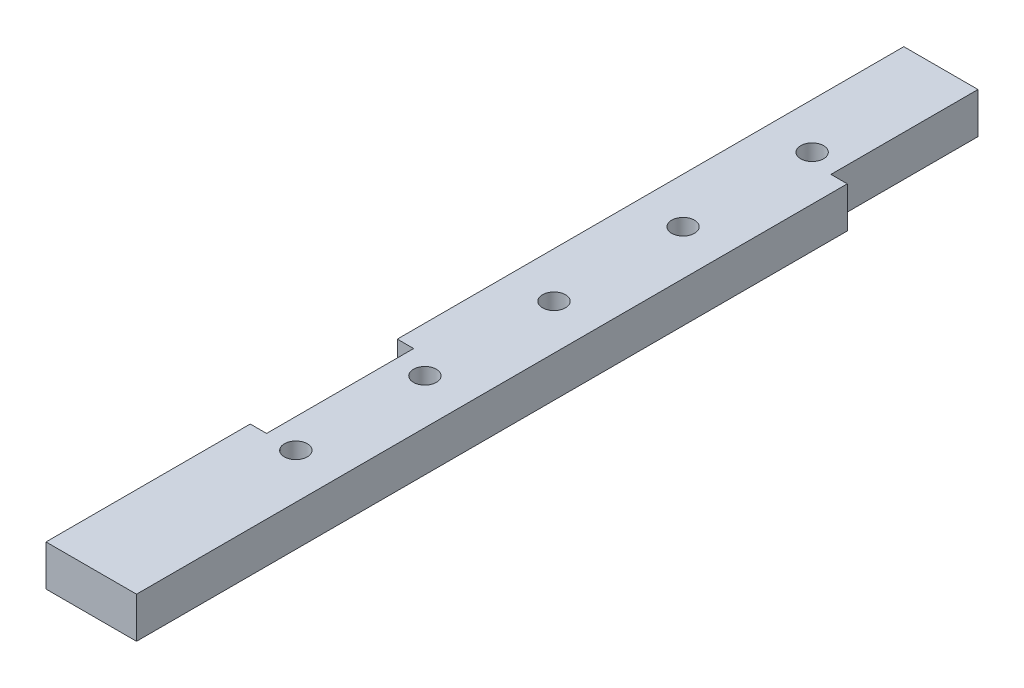
ISO-10303-21;
HEADER;
FILE_DESCRIPTION(('STEP AP214'),'2;1');
FILE_NAME('part.step','',(''),(''),'','','');
FILE_SCHEMA(('AUTOMOTIVE_DESIGN { 1 0 10303 214 1 1 1 1 }'));
ENDSEC;
DATA;
#1=APPLICATION_CONTEXT('core data for automotive mechanical design processes');
#2=APPLICATION_PROTOCOL_DEFINITION('international standard','automotive_design',2000,#1);
#3=PRODUCT_CONTEXT('',#1,'mechanical');
#4=PRODUCT('Part','Part','',(#3));
#5=PRODUCT_RELATED_PRODUCT_CATEGORY('part','',(#4));
#6=PRODUCT_DEFINITION_FORMATION('','',#4);
#7=PRODUCT_DEFINITION_CONTEXT('part definition',#1,'design');
#8=PRODUCT_DEFINITION('design','',#6,#7);
#9=PRODUCT_DEFINITION_SHAPE('','',#8);
#10=(LENGTH_UNIT() NAMED_UNIT(*) SI_UNIT(.MILLI.,.METRE.));
#11=(NAMED_UNIT(*) PLANE_ANGLE_UNIT() SI_UNIT($,.RADIAN.));
#12=(NAMED_UNIT(*) SI_UNIT($,.STERADIAN.) SOLID_ANGLE_UNIT());
#13=UNCERTAINTY_MEASURE_WITH_UNIT(LENGTH_MEASURE(1.E-05),#10,'distance_accuracy_value','');
#14=(GEOMETRIC_REPRESENTATION_CONTEXT(3) GLOBAL_UNCERTAINTY_ASSIGNED_CONTEXT((#13)) GLOBAL_UNIT_ASSIGNED_CONTEXT((#10,
#11,#12)) REPRESENTATION_CONTEXT('',''));
#15=CARTESIAN_POINT('',(0.,0.,0.));
#16=DIRECTION('',(0.,0.,1.));
#17=DIRECTION('',(1.,0.,0.));
#18=AXIS2_PLACEMENT_3D('',#15,#16,#17);
#19=CARTESIAN_POINT('',(5.08000000000003,42.164,0.));
#20=DIRECTION('',(1.,0.,0.));
#21=DIRECTION('',(0.,0.,-1.));
#22=AXIS2_PLACEMENT_3D('',#19,#20,#21);
#23=PLANE('',#22);
#24=DIRECTION('',(0.,0.,1.));
#25=VECTOR('',#24,1.);
#26=CARTESIAN_POINT('',(5.08000000000002,6.35,120.65));
#27=LINE('',#26,#25);
#28=CARTESIAN_POINT('',(5.08000000000003,6.35,88.9));
#29=VERTEX_POINT('',#28);
#30=CARTESIAN_POINT('',(5.08000000000002,6.35,120.65));
#31=VERTEX_POINT('',#30);
#32=EDGE_CURVE('E185',#29,#31,#27,.T.);
#33=ORIENTED_EDGE('',*,*,#32,.F.);
#34=DIRECTION('',(0.,-1.,0.));
#35=VECTOR('',#34,1.);
#36=CARTESIAN_POINT('',(5.08000000000003,29.350678250869,88.9));
#37=LINE('',#36,#35);
#38=CARTESIAN_POINT('',(5.08000000000003,0.,88.9));
#39=VERTEX_POINT('',#38);
#40=EDGE_CURVE('E166',#29,#39,#37,.T.);
#41=ORIENTED_EDGE('',*,*,#40,.T.);
#42=DIRECTION('',(0.,0.,1.));
#43=VECTOR('',#42,1.);
#44=CARTESIAN_POINT('',(5.08000000000003,0.,0.));
#45=LINE('',#44,#43);
#46=CARTESIAN_POINT('',(5.08000000000002,0.,120.65));
#47=VERTEX_POINT('',#46);
#48=EDGE_CURVE('E127',#39,#47,#45,.T.);
#49=ORIENTED_EDGE('',*,*,#48,.T.);
#50=DIRECTION('',(0.,-1.,0.));
#51=VECTOR('',#50,1.);
#52=CARTESIAN_POINT('',(5.08000000000002,42.164,120.65));
#53=LINE('',#52,#51);
#54=EDGE_CURVE('E126',#31,#47,#53,.T.);
#55=ORIENTED_EDGE('',*,*,#54,.F.);
#56=EDGE_LOOP('',(#33,#41,#49,#55));
#57=FACE_BOUND('',#56,.T.);
#58=ADVANCED_FACE('F37',(#57),#23,.F.);
#59=CARTESIAN_POINT('',(0.,0.,120.65));
#60=DIRECTION('',(0.,1.,0.));
#61=DIRECTION('',(0.,0.,1.));
#62=AXIS2_PLACEMENT_3D('',#59,#60,#61);
#63=PLANE('',#62);
#64=CARTESIAN_POINT('',(12.1666,0.,8.63599999999999));
#65=DIRECTION('',(0.,-1.,0.));
#66=DIRECTION('',(0.,0.,-1.));
#67=AXIS2_PLACEMENT_3D('',#64,#65,#66);
#68=CIRCLE('',#67,1.77799999999999);
#69=CARTESIAN_POINT('',(12.1666,0.,6.858));
#70=VERTEX_POINT('',#69);
#71=EDGE_CURVE('E293',#70,#70,#68,.T.);
#72=ORIENTED_EDGE('',*,*,#71,.F.);
#73=EDGE_LOOP('',(#72));
#74=FACE_BOUND('',#73,.T.);
#75=CARTESIAN_POINT('',(12.1666,0.,28.702));
#76=DIRECTION('',(0.,-1.,0.));
#77=DIRECTION('',(0.,0.,-1.));
#78=AXIS2_PLACEMENT_3D('',#75,#76,#77);
#79=CIRCLE('',#78,1.77799999999999);
#80=CARTESIAN_POINT('',(12.1666,0.,26.924));
#81=VERTEX_POINT('',#80);
#82=EDGE_CURVE('E289',#81,#81,#79,.T.);
#83=ORIENTED_EDGE('',*,*,#82,.F.);
#84=EDGE_LOOP('',(#83));
#85=FACE_BOUND('',#84,.T.);
#86=CARTESIAN_POINT('',(12.1666,0.,48.768));
#87=DIRECTION('',(0.,-1.,0.));
#88=DIRECTION('',(0.,0.,-1.));
#89=AXIS2_PLACEMENT_3D('',#86,#87,#88);
#90=CIRCLE('',#89,1.77799999999999);
#91=CARTESIAN_POINT('',(12.1666,0.,46.99));
#92=VERTEX_POINT('',#91);
#93=EDGE_CURVE('E285',#92,#92,#90,.T.);
#94=ORIENTED_EDGE('',*,*,#93,.F.);
#95=EDGE_LOOP('',(#94));
#96=FACE_BOUND('',#95,.T.);
#97=CARTESIAN_POINT('',(12.1666,0.,68.834));
#98=DIRECTION('',(0.,-1.,0.));
#99=DIRECTION('',(0.,0.,-1.));
#100=AXIS2_PLACEMENT_3D('',#97,#98,#99);
#101=CIRCLE('',#100,1.77799999999999);
#102=CARTESIAN_POINT('',(12.1666,0.,67.056));
#103=VERTEX_POINT('',#102);
#104=EDGE_CURVE('E279',#103,#103,#101,.T.);
#105=ORIENTED_EDGE('',*,*,#104,.F.);
#106=EDGE_LOOP('',(#105));
#107=FACE_BOUND('',#106,.T.);
#108=CARTESIAN_POINT('',(12.1666,0.,88.9));
#109=DIRECTION('',(0.,-1.,0.));
#110=DIRECTION('',(0.,0.,-1.));
#111=AXIS2_PLACEMENT_3D('',#108,#109,#110);
#112=CIRCLE('',#111,1.77799999999999);
#113=CARTESIAN_POINT('',(12.1666,0.,87.122));
#114=VERTEX_POINT('',#113);
#115=EDGE_CURVE('E145',#114,#114,#112,.T.);
#116=ORIENTED_EDGE('',*,*,#115,.F.);
#117=EDGE_LOOP('',(#116));
#118=FACE_BOUND('',#117,.T.);
#119=CARTESIAN_POINT('',(5.08000000000003,0.,-12.7));
#120=VERTEX_POINT('',#119);
#121=CARTESIAN_POINT('',(5.08000000000003,0.,66.04));
#122=VERTEX_POINT('',#121);
#123=EDGE_CURVE('E117',#120,#122,#45,.T.);
#124=ORIENTED_EDGE('',*,*,#123,.F.);
#125=DIRECTION('',(1.,0.,0.));
#126=VECTOR('',#125,1.);
#127=CARTESIAN_POINT('',(0.,0.,-12.7));
#128=LINE('',#127,#126);
#129=CARTESIAN_POINT('',(16.6116,0.,-12.7));
#130=VERTEX_POINT('',#129);
#131=EDGE_CURVE('E121',#120,#130,#128,.T.);
#132=ORIENTED_EDGE('',*,*,#131,.T.);
#133=DIRECTION('',(0.,0.,-1.));
#134=VECTOR('',#133,1.);
#135=CARTESIAN_POINT('',(16.6116,0.,-12.7));
#136=LINE('',#135,#134);
#137=CARTESIAN_POINT('',(16.6116,0.,10.16));
#138=VERTEX_POINT('',#137);
#139=EDGE_CURVE('E157',#138,#130,#136,.T.);
#140=ORIENTED_EDGE('',*,*,#139,.F.);
#141=DIRECTION('',(-1.,0.,0.));
#142=VECTOR('',#141,1.);
#143=CARTESIAN_POINT('',(19.1516,0.,10.16));
#144=LINE('',#143,#142);
#145=CARTESIAN_POINT('',(19.1516,0.,10.16));
#146=VERTEX_POINT('',#145);
#147=EDGE_CURVE('E154',#146,#138,#144,.T.);
#148=ORIENTED_EDGE('',*,*,#147,.F.);
#149=DIRECTION('',(0.,0.,1.));
#150=VECTOR('',#149,1.);
#151=CARTESIAN_POINT('',(19.1516,0.,0.));
#152=LINE('',#151,#150);
#153=CARTESIAN_POINT('',(19.1516,0.,120.65));
#154=VERTEX_POINT('',#153);
#155=EDGE_CURVE('E187',#146,#154,#152,.T.);
#156=ORIENTED_EDGE('',*,*,#155,.T.);
#157=DIRECTION('',(1.,0.,0.));
#158=VECTOR('',#157,1.);
#159=CARTESIAN_POINT('',(0.,0.,120.65));
#160=LINE('',#159,#158);
#161=EDGE_CURVE('E45',#47,#154,#160,.T.);
#162=ORIENTED_EDGE('',*,*,#161,.F.);
#163=ORIENTED_EDGE('',*,*,#48,.F.);
#164=DIRECTION('',(-1.,0.,0.));
#165=VECTOR('',#164,1.);
#166=CARTESIAN_POINT('',(5.08000000000003,0.,88.9));
#167=LINE('',#166,#165);
#168=CARTESIAN_POINT('',(7.62000000000003,0.,88.9));
#169=VERTEX_POINT('',#168);
#170=EDGE_CURVE('E172',#169,#39,#167,.T.);
#171=ORIENTED_EDGE('',*,*,#170,.F.);
#172=DIRECTION('',(0.,0.,1.));
#173=VECTOR('',#172,1.);
#174=CARTESIAN_POINT('',(7.62000000000003,0.,88.9));
#175=LINE('',#174,#173);
#176=CARTESIAN_POINT('',(7.62000000000003,0.,66.04));
#177=VERTEX_POINT('',#176);
#178=EDGE_CURVE('E169',#177,#169,#175,.T.);
#179=ORIENTED_EDGE('',*,*,#178,.F.);
#180=DIRECTION('',(1.,0.,0.));
#181=VECTOR('',#180,1.);
#182=CARTESIAN_POINT('',(5.08000000000003,0.,66.04));
#183=LINE('',#182,#181);
#184=EDGE_CURVE('E124',#122,#177,#183,.T.);
#185=ORIENTED_EDGE('',*,*,#184,.F.);
#186=EDGE_LOOP('',(#124,#132,#140,#148,#156,#162,#163,#171,#179,#185));
#187=FACE_BOUND('',#186,.T.);
#188=ADVANCED_FACE('F39',(#74,#85,#96,#107,#118,#187),#63,.F.);
#189=CARTESIAN_POINT('',(0.,6.35,120.65));
#190=DIRECTION('',(0.,-1.,0.));
#191=DIRECTION('',(0.,0.,-1.));
#192=AXIS2_PLACEMENT_3D('',#189,#190,#191);
#193=PLANE('',#192);
#194=CARTESIAN_POINT('',(12.1666,6.35,8.63599999999999));
#195=DIRECTION('',(0.,-1.,0.));
#196=DIRECTION('',(0.,0.,-1.));
#197=AXIS2_PLACEMENT_3D('',#194,#195,#196);
#198=CIRCLE('',#197,1.77799999999999);
#199=CARTESIAN_POINT('',(12.1666,6.35,6.858));
#200=VERTEX_POINT('',#199);
#201=EDGE_CURVE('E256',#200,#200,#198,.F.);
#202=ORIENTED_EDGE('',*,*,#201,.F.);
#203=EDGE_LOOP('',(#202));
#204=FACE_BOUND('',#203,.T.);
#205=CARTESIAN_POINT('',(12.1666,6.35,28.702));
#206=DIRECTION('',(0.,-1.,0.));
#207=DIRECTION('',(0.,0.,-1.));
#208=AXIS2_PLACEMENT_3D('',#205,#206,#207);
#209=CIRCLE('',#208,1.77799999999999);
#210=CARTESIAN_POINT('',(12.1666,6.35,26.924));
#211=VERTEX_POINT('',#210);
#212=EDGE_CURVE('E260',#211,#211,#209,.F.);
#213=ORIENTED_EDGE('',*,*,#212,.F.);
#214=EDGE_LOOP('',(#213));
#215=FACE_BOUND('',#214,.T.);
#216=CARTESIAN_POINT('',(12.1666,6.35,48.768));
#217=DIRECTION('',(0.,-1.,0.));
#218=DIRECTION('',(0.,0.,-1.));
#219=AXIS2_PLACEMENT_3D('',#216,#217,#218);
#220=CIRCLE('',#219,1.77799999999999);
#221=CARTESIAN_POINT('',(12.1666,6.35,46.99));
#222=VERTEX_POINT('',#221);
#223=EDGE_CURVE('E264',#222,#222,#220,.F.);
#224=ORIENTED_EDGE('',*,*,#223,.F.);
#225=EDGE_LOOP('',(#224));
#226=FACE_BOUND('',#225,.T.);
#227=CARTESIAN_POINT('',(12.1666,6.35,68.834));
#228=DIRECTION('',(0.,-1.,0.));
#229=DIRECTION('',(0.,0.,-1.));
#230=AXIS2_PLACEMENT_3D('',#227,#228,#229);
#231=CIRCLE('',#230,1.77799999999999);
#232=CARTESIAN_POINT('',(12.1666,6.35,67.056));
#233=VERTEX_POINT('',#232);
#234=EDGE_CURVE('E268',#233,#233,#231,.F.);
#235=ORIENTED_EDGE('',*,*,#234,.F.);
#236=EDGE_LOOP('',(#235));
#237=FACE_BOUND('',#236,.T.);
#238=CARTESIAN_POINT('',(12.1666,6.35,88.9));
#239=DIRECTION('',(0.,-1.,0.));
#240=DIRECTION('',(0.,0.,-1.));
#241=AXIS2_PLACEMENT_3D('',#238,#239,#240);
#242=CIRCLE('',#241,1.77799999999999);
#243=CARTESIAN_POINT('',(12.1666,6.35,87.122));
#244=VERTEX_POINT('',#243);
#245=EDGE_CURVE('E142',#244,#244,#242,.F.);
#246=ORIENTED_EDGE('',*,*,#245,.F.);
#247=EDGE_LOOP('',(#246));
#248=FACE_BOUND('',#247,.T.);
#249=DIRECTION('',(1.,0.,0.));
#250=VECTOR('',#249,1.);
#251=CARTESIAN_POINT('',(19.1516,6.35,10.16));
#252=LINE('',#251,#250);
#253=CARTESIAN_POINT('',(16.6116,6.35,10.16));
#254=VERTEX_POINT('',#253);
#255=CARTESIAN_POINT('',(19.1516,6.35,10.16));
#256=VERTEX_POINT('',#255);
#257=EDGE_CURVE('E52',#254,#256,#252,.T.);
#258=ORIENTED_EDGE('',*,*,#257,.F.);
#259=DIRECTION('',(0.,0.,1.));
#260=VECTOR('',#259,1.);
#261=CARTESIAN_POINT('',(16.6116,6.35,-12.7));
#262=LINE('',#261,#260);
#263=CARTESIAN_POINT('',(16.6116,6.35,-12.7));
#264=VERTEX_POINT('',#263);
#265=EDGE_CURVE('E151',#264,#254,#262,.T.);
#266=ORIENTED_EDGE('',*,*,#265,.F.);
#267=DIRECTION('',(-1.,0.,0.));
#268=VECTOR('',#267,1.);
#269=CARTESIAN_POINT('',(0.,6.35,-12.7));
#270=LINE('',#269,#268);
#271=CARTESIAN_POINT('',(5.08000000000003,6.35,-12.7));
#272=VERTEX_POINT('',#271);
#273=EDGE_CURVE('E149',#264,#272,#270,.T.);
#274=ORIENTED_EDGE('',*,*,#273,.T.);
#275=CARTESIAN_POINT('',(5.08000000000002,6.35,66.04));
#276=VERTEX_POINT('',#275);
#277=EDGE_CURVE('E133',#272,#276,#27,.T.);
#278=ORIENTED_EDGE('',*,*,#277,.T.);
#279=DIRECTION('',(-1.,0.,0.));
#280=VECTOR('',#279,1.);
#281=CARTESIAN_POINT('',(5.08000000000003,6.35,66.04));
#282=LINE('',#281,#280);
#283=CARTESIAN_POINT('',(7.62000000000003,6.35,66.04));
#284=VERTEX_POINT('',#283);
#285=EDGE_CURVE('E60',#284,#276,#282,.T.);
#286=ORIENTED_EDGE('',*,*,#285,.F.);
#287=DIRECTION('',(0.,0.,-1.));
#288=VECTOR('',#287,1.);
#289=CARTESIAN_POINT('',(7.62000000000003,6.35,88.9));
#290=LINE('',#289,#288);
#291=CARTESIAN_POINT('',(7.62000000000003,6.35,88.9));
#292=VERTEX_POINT('',#291);
#293=EDGE_CURVE('E163',#292,#284,#290,.T.);
#294=ORIENTED_EDGE('',*,*,#293,.F.);
#295=DIRECTION('',(1.,0.,0.));
#296=VECTOR('',#295,1.);
#297=CARTESIAN_POINT('',(5.08000000000003,6.35,88.9));
#298=LINE('',#297,#296);
#299=EDGE_CURVE('E165',#29,#292,#298,.T.);
#300=ORIENTED_EDGE('',*,*,#299,.F.);
#301=ORIENTED_EDGE('',*,*,#32,.T.);
#302=DIRECTION('',(-1.,0.,0.));
#303=VECTOR('',#302,1.);
#304=CARTESIAN_POINT('',(0.,6.35,120.65));
#305=LINE('',#304,#303);
#306=CARTESIAN_POINT('',(19.1516,6.35,120.65));
#307=VERTEX_POINT('',#306);
#308=EDGE_CURVE('E11',#307,#31,#305,.T.);
#309=ORIENTED_EDGE('',*,*,#308,.F.);
#310=DIRECTION('',(0.,0.,1.));
#311=VECTOR('',#310,1.);
#312=CARTESIAN_POINT('',(19.1516,6.35,120.65));
#313=LINE('',#312,#311);
#314=EDGE_CURVE('E192',#256,#307,#313,.T.);
#315=ORIENTED_EDGE('',*,*,#314,.F.);
#316=EDGE_LOOP('',(#258,#266,#274,#278,#286,#294,#300,#301,#309,#315));
#317=FACE_BOUND('',#316,.T.);
#318=ADVANCED_FACE('F206',(#204,#215,#226,#237,#248,#317),#193,.F.);
#319=CARTESIAN_POINT('',(0.,0.,120.65));
#320=DIRECTION('',(0.,0.,-1.));
#321=DIRECTION('',(-1.,0.,0.));
#322=AXIS2_PLACEMENT_3D('',#319,#320,#321);
#323=PLANE('',#322);
#324=ORIENTED_EDGE('',*,*,#308,.T.);
#325=ORIENTED_EDGE('',*,*,#54,.T.);
#326=ORIENTED_EDGE('',*,*,#161,.T.);
#327=DIRECTION('',(0.,-1.,0.));
#328=VECTOR('',#327,1.);
#329=CARTESIAN_POINT('',(19.1516,42.164,120.65));
#330=LINE('',#329,#328);
#331=EDGE_CURVE('E189',#307,#154,#330,.T.);
#332=ORIENTED_EDGE('',*,*,#331,.F.);
#333=EDGE_LOOP('',(#324,#325,#326,#332));
#334=FACE_BOUND('',#333,.T.);
#335=ADVANCED_FACE('F197',(#334),#323,.F.);
#336=CARTESIAN_POINT('',(19.1516,42.164,0.));
#337=DIRECTION('',(1.,0.,0.));
#338=DIRECTION('',(0.,0.,-1.));
#339=AXIS2_PLACEMENT_3D('',#336,#337,#338);
#340=PLANE('',#339);
#341=DIRECTION('',(0.,-1.,0.));
#342=VECTOR('',#341,1.);
#343=CARTESIAN_POINT('',(19.1516,29.350678250869,10.16));
#344=LINE('',#343,#342);
#345=EDGE_CURVE('E159',#256,#146,#344,.T.);
#346=ORIENTED_EDGE('',*,*,#345,.F.);
#347=ORIENTED_EDGE('',*,*,#314,.T.);
#348=ORIENTED_EDGE('',*,*,#331,.T.);
#349=ORIENTED_EDGE('',*,*,#155,.F.);
#350=EDGE_LOOP('',(#346,#347,#348,#349));
#351=FACE_BOUND('',#350,.T.);
#352=ADVANCED_FACE('F203',(#351),#340,.T.);
#353=ORIENTED_EDGE('',*,*,#123,.T.);
#354=DIRECTION('',(0.,-1.,0.));
#355=VECTOR('',#354,1.);
#356=CARTESIAN_POINT('',(5.08000000000003,29.350678250869,66.04));
#357=LINE('',#356,#355);
#358=EDGE_CURVE('E174',#276,#122,#357,.T.);
#359=ORIENTED_EDGE('',*,*,#358,.F.);
#360=ORIENTED_EDGE('',*,*,#277,.F.);
#361=DIRECTION('',(0.,-1.,0.));
#362=VECTOR('',#361,1.);
#363=CARTESIAN_POINT('',(5.08000000000003,23.5042355865833,-12.7));
#364=LINE('',#363,#362);
#365=EDGE_CURVE('E130',#272,#120,#364,.T.);
#366=ORIENTED_EDGE('',*,*,#365,.T.);
#367=EDGE_LOOP('',(#353,#359,#360,#366));
#368=FACE_BOUND('',#367,.T.);
#369=ADVANCED_FACE('F131',(#368),#23,.F.);
#370=CARTESIAN_POINT('',(5.08000000000003,29.350678250869,88.9));
#371=DIRECTION('',(0.,0.,1.));
#372=DIRECTION('',(1.,0.,0.));
#373=AXIS2_PLACEMENT_3D('',#370,#371,#372);
#374=PLANE('',#373);
#375=ORIENTED_EDGE('',*,*,#299,.T.);
#376=DIRECTION('',(0.,-1.,0.));
#377=VECTOR('',#376,1.);
#378=CARTESIAN_POINT('',(7.62000000000003,29.350678250869,88.9));
#379=LINE('',#378,#377);
#380=EDGE_CURVE('E177',#292,#169,#379,.T.);
#381=ORIENTED_EDGE('',*,*,#380,.T.);
#382=ORIENTED_EDGE('',*,*,#170,.T.);
#383=ORIENTED_EDGE('',*,*,#40,.F.);
#384=EDGE_LOOP('',(#375,#381,#382,#383));
#385=FACE_BOUND('',#384,.T.);
#386=ADVANCED_FACE('F213',(#385),#374,.F.);
#387=CARTESIAN_POINT('',(7.62000000000003,29.350678250869,88.9));
#388=DIRECTION('',(1.,0.,0.));
#389=DIRECTION('',(0.,0.,-1.));
#390=AXIS2_PLACEMENT_3D('',#387,#388,#389);
#391=PLANE('',#390);
#392=ORIENTED_EDGE('',*,*,#293,.T.);
#393=DIRECTION('',(0.,-1.,0.));
#394=VECTOR('',#393,1.);
#395=CARTESIAN_POINT('',(7.62000000000003,29.350678250869,66.04));
#396=LINE('',#395,#394);
#397=EDGE_CURVE('E179',#284,#177,#396,.T.);
#398=ORIENTED_EDGE('',*,*,#397,.T.);
#399=ORIENTED_EDGE('',*,*,#178,.T.);
#400=ORIENTED_EDGE('',*,*,#380,.F.);
#401=EDGE_LOOP('',(#392,#398,#399,#400));
#402=FACE_BOUND('',#401,.T.);
#403=ADVANCED_FACE('F216',(#402),#391,.F.);
#404=CARTESIAN_POINT('',(5.08000000000003,29.350678250869,66.04));
#405=DIRECTION('',(0.,0.,-1.));
#406=DIRECTION('',(-1.,0.,0.));
#407=AXIS2_PLACEMENT_3D('',#404,#405,#406);
#408=PLANE('',#407);
#409=ORIENTED_EDGE('',*,*,#285,.T.);
#410=ORIENTED_EDGE('',*,*,#358,.T.);
#411=ORIENTED_EDGE('',*,*,#184,.T.);
#412=ORIENTED_EDGE('',*,*,#397,.F.);
#413=EDGE_LOOP('',(#409,#410,#411,#412));
#414=FACE_BOUND('',#413,.T.);
#415=ADVANCED_FACE('F217',(#414),#408,.F.);
#416=CARTESIAN_POINT('',(16.6116,29.350678250869,-12.7));
#417=DIRECTION('',(-1.,0.,0.));
#418=DIRECTION('',(0.,0.,1.));
#419=AXIS2_PLACEMENT_3D('',#416,#417,#418);
#420=PLANE('',#419);
#421=ORIENTED_EDGE('',*,*,#139,.T.);
#422=DIRECTION('',(0.,-1.,0.));
#423=VECTOR('',#422,1.);
#424=CARTESIAN_POINT('',(16.6116,23.5042355865833,-12.7));
#425=LINE('',#424,#423);
#426=EDGE_CURVE('E137',#264,#130,#425,.T.);
#427=ORIENTED_EDGE('',*,*,#426,.F.);
#428=ORIENTED_EDGE('',*,*,#265,.T.);
#429=DIRECTION('',(0.,-1.,0.));
#430=VECTOR('',#429,1.);
#431=CARTESIAN_POINT('',(16.6116,29.350678250869,10.16));
#432=LINE('',#431,#430);
#433=EDGE_CURVE('E153',#254,#138,#432,.T.);
#434=ORIENTED_EDGE('',*,*,#433,.T.);
#435=EDGE_LOOP('',(#421,#427,#428,#434));
#436=FACE_BOUND('',#435,.T.);
#437=ADVANCED_FACE('F219',(#436),#420,.F.);
#438=CARTESIAN_POINT('',(19.1516,29.350678250869,10.16));
#439=DIRECTION('',(0.,0.,1.));
#440=DIRECTION('',(1.,0.,0.));
#441=AXIS2_PLACEMENT_3D('',#438,#439,#440);
#442=PLANE('',#441);
#443=ORIENTED_EDGE('',*,*,#257,.T.);
#444=ORIENTED_EDGE('',*,*,#345,.T.);
#445=ORIENTED_EDGE('',*,*,#147,.T.);
#446=ORIENTED_EDGE('',*,*,#433,.F.);
#447=EDGE_LOOP('',(#443,#444,#445,#446));
#448=FACE_BOUND('',#447,.T.);
#449=ADVANCED_FACE('F221',(#448),#442,.F.);
#450=CARTESIAN_POINT('',(0.,23.5042355865833,-12.7));
#451=DIRECTION('',(0.,0.,-1.));
#452=DIRECTION('',(-1.,0.,0.));
#453=AXIS2_PLACEMENT_3D('',#450,#451,#452);
#454=PLANE('',#453);
#455=ORIENTED_EDGE('',*,*,#273,.F.);
#456=ORIENTED_EDGE('',*,*,#426,.T.);
#457=ORIENTED_EDGE('',*,*,#131,.F.);
#458=ORIENTED_EDGE('',*,*,#365,.F.);
#459=EDGE_LOOP('',(#455,#456,#457,#458));
#460=FACE_BOUND('',#459,.T.);
#461=ADVANCED_FACE('F140',(#460),#454,.T.);
#462=CARTESIAN_POINT('',(12.1666,11.3789434277987,88.9));
#463=DIRECTION('',(0.,-1.,0.));
#464=DIRECTION('',(0.,0.,-1.));
#465=AXIS2_PLACEMENT_3D('',#462,#463,#464);
#466=CYLINDRICAL_SURFACE('',#465,1.77799999999999);
#467=CARTESIAN_POINT('',(12.1666,6.35,87.122));
#468=CARTESIAN_POINT('',(12.1666,6.28385416666667,87.122));
#469=CARTESIAN_POINT('',(12.1666,6.21770833333333,87.122));
#470=CARTESIAN_POINT('',(12.1666,6.08541666666667,87.122));
#471=CARTESIAN_POINT('',(12.1666,6.01927083333333,87.122));
#472=CARTESIAN_POINT('',(12.1666,5.88697916666667,87.122));
#473=CARTESIAN_POINT('',(12.1666,5.82083333333333,87.122));
#474=CARTESIAN_POINT('',(12.1666,5.68854166666667,87.122));
#475=CARTESIAN_POINT('',(12.1666,5.62239583333333,87.122));
#476=CARTESIAN_POINT('',(12.1666,5.49010416666667,87.122));
#477=CARTESIAN_POINT('',(12.1666,5.42395833333333,87.122));
#478=CARTESIAN_POINT('',(12.1666,5.29166666666667,87.122));
#479=CARTESIAN_POINT('',(12.1666,5.22552083333333,87.122));
#480=CARTESIAN_POINT('',(12.1666,5.09322916666667,87.122));
#481=CARTESIAN_POINT('',(12.1666,5.02708333333333,87.122));
#482=CARTESIAN_POINT('',(12.1666,4.89479166666667,87.122));
#483=CARTESIAN_POINT('',(12.1666,4.82864583333333,87.122));
#484=CARTESIAN_POINT('',(12.1666,4.69635416666667,87.122));
#485=CARTESIAN_POINT('',(12.1666,4.63020833333333,87.122));
#486=CARTESIAN_POINT('',(12.1666,4.49791666666667,87.122));
#487=CARTESIAN_POINT('',(12.1666,4.43177083333333,87.122));
#488=CARTESIAN_POINT('',(12.1666,4.29947916666667,87.122));
#489=CARTESIAN_POINT('',(12.1666,4.23333333333333,87.122));
#490=CARTESIAN_POINT('',(12.1666,4.10104166666667,87.122));
#491=CARTESIAN_POINT('',(12.1666,4.03489583333333,87.122));
#492=CARTESIAN_POINT('',(12.1666,3.90260416666667,87.122));
#493=CARTESIAN_POINT('',(12.1666,3.83645833333333,87.122));
#494=CARTESIAN_POINT('',(12.1666,3.70416666666667,87.122));
#495=CARTESIAN_POINT('',(12.1666,3.63802083333333,87.122));
#496=CARTESIAN_POINT('',(12.1666,3.50572916666667,87.122));
#497=CARTESIAN_POINT('',(12.1666,3.43958333333333,87.122));
#498=CARTESIAN_POINT('',(12.1666,3.30729166666667,87.122));
#499=CARTESIAN_POINT('',(12.1666,3.24114583333334,87.122));
#500=CARTESIAN_POINT('',(12.1666,3.10885416666667,87.122));
#501=CARTESIAN_POINT('',(12.1666,3.04270833333334,87.122));
#502=CARTESIAN_POINT('',(12.1666,2.91041666666667,87.122));
#503=CARTESIAN_POINT('',(12.1666,2.84427083333333,87.122));
#504=CARTESIAN_POINT('',(12.1666,2.71197916666667,87.122));
#505=CARTESIAN_POINT('',(12.1666,2.64583333333334,87.122));
#506=CARTESIAN_POINT('',(12.1666,2.51354166666667,87.122));
#507=CARTESIAN_POINT('',(12.1666,2.44739583333333,87.122));
#508=CARTESIAN_POINT('',(12.1666,2.31510416666667,87.122));
#509=CARTESIAN_POINT('',(12.1666,2.24895833333333,87.122));
#510=CARTESIAN_POINT('',(12.1666,2.11666666666667,87.122));
#511=CARTESIAN_POINT('',(12.1666,2.05052083333333,87.122));
#512=CARTESIAN_POINT('',(12.1666,1.91822916666667,87.122));
#513=CARTESIAN_POINT('',(12.1666,1.85208333333334,87.122));
#514=CARTESIAN_POINT('',(12.1666,1.71979166666667,87.122));
#515=CARTESIAN_POINT('',(12.1666,1.65364583333334,87.122));
#516=CARTESIAN_POINT('',(12.1666,1.52135416666667,87.122));
#517=CARTESIAN_POINT('',(12.1666,1.45520833333333,87.122));
#518=CARTESIAN_POINT('',(12.1666,1.32291666666667,87.122));
#519=CARTESIAN_POINT('',(12.1666,1.25677083333334,87.122));
#520=CARTESIAN_POINT('',(12.1666,1.12447916666667,87.122));
#521=CARTESIAN_POINT('',(12.1666,1.05833333333334,87.122));
#522=CARTESIAN_POINT('',(12.1666,0.926041666666668,87.122));
#523=CARTESIAN_POINT('',(12.1666,0.859895833333335,87.122));
#524=CARTESIAN_POINT('',(12.1666,0.727604166666668,87.122));
#525=CARTESIAN_POINT('',(12.1666,0.661458333333335,87.122));
#526=CARTESIAN_POINT('',(12.1666,0.529166666666668,87.122));
#527=CARTESIAN_POINT('',(12.1666,0.463020833333335,87.122));
#528=CARTESIAN_POINT('',(12.1666,0.330729166666668,87.122));
#529=CARTESIAN_POINT('',(12.1666,0.264583333333334,87.122));
#530=CARTESIAN_POINT('',(12.1666,0.132291666666668,87.122));
#531=CARTESIAN_POINT('',(12.1666,0.0661458333333348,87.122));
#532=CARTESIAN_POINT('',(12.1666,0.,87.122));
#533=B_SPLINE_CURVE_WITH_KNOTS('',3,(#467,#468,#469,#470,#471,#472,#473,#474,#475,#476,#477,
#478,#479,#480,#481,#482,#483,#484,#485,#486,#487,#488,#489,#490,#491,#492,#493,#494,#495,#496,
#497,#498,#499,#500,#501,#502,#503,#504,#505,#506,#507,#508,#509,#510,#511,#512,#513,#514,#515,
#516,#517,#518,#519,#520,#521,#522,#523,#524,#525,#526,#527,#528,#529,#530,#531,#532),
.UNSPECIFIED.,.F.,.F.,(4,2,2,2,2,2,2,2,2,2,2,2,2,2,2,2,2,2,2,2,2,2,2,2,2,2,2,2,2,2,2,2,4),(0.,
0.1984375,0.396875,0.5953125,0.79375,0.9921875,1.190625,1.3890625,1.5875,1.7859375,1.984375,
2.1828125,2.38125,2.5796875,2.778125,2.9765625,3.175,3.3734375,3.571875,3.7703125,3.96875,
4.1671875,4.365625,4.5640625,4.7625,4.9609375,5.159375,5.3578125,5.55625,5.7546875,5.953125,
6.1515625,6.35),.UNSPECIFIED.);
#534=EDGE_CURVE('BSEAM228',#244,#114,#533,.T.);
#535=ORIENTED_EDGE('',*,*,#245,.T.);
#536=ORIENTED_EDGE('',*,*,#115,.T.);
#537=ORIENTED_EDGE('',*,*,#534,.T.);
#538=ORIENTED_EDGE('',*,*,#534,.F.);
#539=EDGE_LOOP('',(#535,#537,#536,#538));
#540=FACE_BOUND('',#539,.T.);
#541=ADVANCED_FACE('F228',(#540),#466,.F.);
#542=CARTESIAN_POINT('',(12.1666,11.3789434277987,68.834));
#543=DIRECTION('',(0.,-1.,0.));
#544=DIRECTION('',(0.,0.,-1.));
#545=AXIS2_PLACEMENT_3D('',#542,#543,#544);
#546=CYLINDRICAL_SURFACE('',#545,1.77799999999999);
#547=CARTESIAN_POINT('',(12.1666,6.35,67.056));
#548=CARTESIAN_POINT('',(12.1666,6.28385416666667,67.056));
#549=CARTESIAN_POINT('',(12.1666,6.21770833333333,67.056));
#550=CARTESIAN_POINT('',(12.1666,6.08541666666667,67.056));
#551=CARTESIAN_POINT('',(12.1666,6.01927083333333,67.056));
#552=CARTESIAN_POINT('',(12.1666,5.88697916666667,67.056));
#553=CARTESIAN_POINT('',(12.1666,5.82083333333333,67.056));
#554=CARTESIAN_POINT('',(12.1666,5.68854166666667,67.056));
#555=CARTESIAN_POINT('',(12.1666,5.62239583333333,67.056));
#556=CARTESIAN_POINT('',(12.1666,5.49010416666667,67.056));
#557=CARTESIAN_POINT('',(12.1666,5.42395833333333,67.056));
#558=CARTESIAN_POINT('',(12.1666,5.29166666666667,67.056));
#559=CARTESIAN_POINT('',(12.1666,5.22552083333333,67.056));
#560=CARTESIAN_POINT('',(12.1666,5.09322916666667,67.056));
#561=CARTESIAN_POINT('',(12.1666,5.02708333333333,67.056));
#562=CARTESIAN_POINT('',(12.1666,4.89479166666667,67.056));
#563=CARTESIAN_POINT('',(12.1666,4.82864583333333,67.056));
#564=CARTESIAN_POINT('',(12.1666,4.69635416666667,67.056));
#565=CARTESIAN_POINT('',(12.1666,4.63020833333333,67.056));
#566=CARTESIAN_POINT('',(12.1666,4.49791666666667,67.056));
#567=CARTESIAN_POINT('',(12.1666,4.43177083333333,67.056));
#568=CARTESIAN_POINT('',(12.1666,4.29947916666667,67.056));
#569=CARTESIAN_POINT('',(12.1666,4.23333333333333,67.056));
#570=CARTESIAN_POINT('',(12.1666,4.10104166666667,67.056));
#571=CARTESIAN_POINT('',(12.1666,4.03489583333333,67.056));
#572=CARTESIAN_POINT('',(12.1666,3.90260416666667,67.056));
#573=CARTESIAN_POINT('',(12.1666,3.83645833333333,67.056));
#574=CARTESIAN_POINT('',(12.1666,3.70416666666667,67.056));
#575=CARTESIAN_POINT('',(12.1666,3.63802083333333,67.056));
#576=CARTESIAN_POINT('',(12.1666,3.50572916666667,67.056));
#577=CARTESIAN_POINT('',(12.1666,3.43958333333333,67.056));
#578=CARTESIAN_POINT('',(12.1666,3.30729166666667,67.056));
#579=CARTESIAN_POINT('',(12.1666,3.24114583333334,67.056));
#580=CARTESIAN_POINT('',(12.1666,3.10885416666667,67.056));
#581=CARTESIAN_POINT('',(12.1666,3.04270833333334,67.056));
#582=CARTESIAN_POINT('',(12.1666,2.91041666666667,67.056));
#583=CARTESIAN_POINT('',(12.1666,2.84427083333333,67.056));
#584=CARTESIAN_POINT('',(12.1666,2.71197916666667,67.056));
#585=CARTESIAN_POINT('',(12.1666,2.64583333333334,67.056));
#586=CARTESIAN_POINT('',(12.1666,2.51354166666667,67.056));
#587=CARTESIAN_POINT('',(12.1666,2.44739583333333,67.056));
#588=CARTESIAN_POINT('',(12.1666,2.31510416666667,67.056));
#589=CARTESIAN_POINT('',(12.1666,2.24895833333333,67.056));
#590=CARTESIAN_POINT('',(12.1666,2.11666666666667,67.056));
#591=CARTESIAN_POINT('',(12.1666,2.05052083333333,67.056));
#592=CARTESIAN_POINT('',(12.1666,1.91822916666667,67.056));
#593=CARTESIAN_POINT('',(12.1666,1.85208333333334,67.056));
#594=CARTESIAN_POINT('',(12.1666,1.71979166666667,67.056));
#595=CARTESIAN_POINT('',(12.1666,1.65364583333334,67.056));
#596=CARTESIAN_POINT('',(12.1666,1.52135416666667,67.056));
#597=CARTESIAN_POINT('',(12.1666,1.45520833333333,67.056));
#598=CARTESIAN_POINT('',(12.1666,1.32291666666667,67.056));
#599=CARTESIAN_POINT('',(12.1666,1.25677083333334,67.056));
#600=CARTESIAN_POINT('',(12.1666,1.12447916666667,67.056));
#601=CARTESIAN_POINT('',(12.1666,1.05833333333334,67.056));
#602=CARTESIAN_POINT('',(12.1666,0.926041666666668,67.056));
#603=CARTESIAN_POINT('',(12.1666,0.859895833333335,67.056));
#604=CARTESIAN_POINT('',(12.1666,0.727604166666668,67.056));
#605=CARTESIAN_POINT('',(12.1666,0.661458333333335,67.056));
#606=CARTESIAN_POINT('',(12.1666,0.529166666666668,67.056));
#607=CARTESIAN_POINT('',(12.1666,0.463020833333335,67.056));
#608=CARTESIAN_POINT('',(12.1666,0.330729166666668,67.056));
#609=CARTESIAN_POINT('',(12.1666,0.264583333333334,67.056));
#610=CARTESIAN_POINT('',(12.1666,0.132291666666668,67.056));
#611=CARTESIAN_POINT('',(12.1666,0.0661458333333348,67.056));
#612=CARTESIAN_POINT('',(12.1666,0.,67.056));
#613=B_SPLINE_CURVE_WITH_KNOTS('',3,(#547,#548,#549,#550,#551,#552,#553,#554,#555,#556,#557,
#558,#559,#560,#561,#562,#563,#564,#565,#566,#567,#568,#569,#570,#571,#572,#573,#574,#575,#576,
#577,#578,#579,#580,#581,#582,#583,#584,#585,#586,#587,#588,#589,#590,#591,#592,#593,#594,#595,
#596,#597,#598,#599,#600,#601,#602,#603,#604,#605,#606,#607,#608,#609,#610,#611,#612),
.UNSPECIFIED.,.F.,.F.,(4,2,2,2,2,2,2,2,2,2,2,2,2,2,2,2,2,2,2,2,2,2,2,2,2,2,2,2,2,2,2,2,4),(0.,
0.1984375,0.396875,0.5953125,0.79375,0.9921875,1.190625,1.3890625,1.5875,1.7859375,1.984375,
2.1828125,2.38125,2.5796875,2.778125,2.9765625,3.175,3.3734375,3.571875,3.7703125,3.96875,
4.1671875,4.365625,4.5640625,4.7625,4.9609375,5.159375,5.3578125,5.55625,5.7546875,5.953125,
6.1515625,6.35),.UNSPECIFIED.);
#614=EDGE_CURVE('BSEAM273',#233,#103,#613,.T.);
#615=ORIENTED_EDGE('',*,*,#234,.T.);
#616=ORIENTED_EDGE('',*,*,#104,.T.);
#617=ORIENTED_EDGE('',*,*,#614,.T.);
#618=ORIENTED_EDGE('',*,*,#614,.F.);
#619=EDGE_LOOP('',(#615,#617,#616,#618));
#620=FACE_BOUND('',#619,.T.);
#621=ADVANCED_FACE('F273',(#620),#546,.F.);
#622=CARTESIAN_POINT('',(12.1666,11.3789434277987,48.768));
#623=DIRECTION('',(0.,-1.,0.));
#624=DIRECTION('',(0.,0.,-1.));
#625=AXIS2_PLACEMENT_3D('',#622,#623,#624);
#626=CYLINDRICAL_SURFACE('',#625,1.77799999999999);
#627=CARTESIAN_POINT('',(12.1666,6.35,46.99));
#628=CARTESIAN_POINT('',(12.1666,6.28385416666667,46.99));
#629=CARTESIAN_POINT('',(12.1666,6.21770833333333,46.99));
#630=CARTESIAN_POINT('',(12.1666,6.08541666666667,46.99));
#631=CARTESIAN_POINT('',(12.1666,6.01927083333333,46.99));
#632=CARTESIAN_POINT('',(12.1666,5.88697916666667,46.99));
#633=CARTESIAN_POINT('',(12.1666,5.82083333333333,46.99));
#634=CARTESIAN_POINT('',(12.1666,5.68854166666667,46.99));
#635=CARTESIAN_POINT('',(12.1666,5.62239583333333,46.99));
#636=CARTESIAN_POINT('',(12.1666,5.49010416666667,46.99));
#637=CARTESIAN_POINT('',(12.1666,5.42395833333333,46.99));
#638=CARTESIAN_POINT('',(12.1666,5.29166666666667,46.99));
#639=CARTESIAN_POINT('',(12.1666,5.22552083333333,46.99));
#640=CARTESIAN_POINT('',(12.1666,5.09322916666667,46.99));
#641=CARTESIAN_POINT('',(12.1666,5.02708333333333,46.99));
#642=CARTESIAN_POINT('',(12.1666,4.89479166666667,46.99));
#643=CARTESIAN_POINT('',(12.1666,4.82864583333333,46.99));
#644=CARTESIAN_POINT('',(12.1666,4.69635416666667,46.99));
#645=CARTESIAN_POINT('',(12.1666,4.63020833333333,46.99));
#646=CARTESIAN_POINT('',(12.1666,4.49791666666667,46.99));
#647=CARTESIAN_POINT('',(12.1666,4.43177083333333,46.99));
#648=CARTESIAN_POINT('',(12.1666,4.29947916666667,46.99));
#649=CARTESIAN_POINT('',(12.1666,4.23333333333333,46.99));
#650=CARTESIAN_POINT('',(12.1666,4.10104166666667,46.99));
#651=CARTESIAN_POINT('',(12.1666,4.03489583333333,46.99));
#652=CARTESIAN_POINT('',(12.1666,3.90260416666667,46.99));
#653=CARTESIAN_POINT('',(12.1666,3.83645833333333,46.99));
#654=CARTESIAN_POINT('',(12.1666,3.70416666666667,46.99));
#655=CARTESIAN_POINT('',(12.1666,3.63802083333333,46.99));
#656=CARTESIAN_POINT('',(12.1666,3.50572916666667,46.99));
#657=CARTESIAN_POINT('',(12.1666,3.43958333333333,46.99));
#658=CARTESIAN_POINT('',(12.1666,3.30729166666667,46.99));
#659=CARTESIAN_POINT('',(12.1666,3.24114583333334,46.99));
#660=CARTESIAN_POINT('',(12.1666,3.10885416666667,46.99));
#661=CARTESIAN_POINT('',(12.1666,3.04270833333334,46.99));
#662=CARTESIAN_POINT('',(12.1666,2.91041666666667,46.99));
#663=CARTESIAN_POINT('',(12.1666,2.84427083333333,46.99));
#664=CARTESIAN_POINT('',(12.1666,2.71197916666667,46.99));
#665=CARTESIAN_POINT('',(12.1666,2.64583333333334,46.99));
#666=CARTESIAN_POINT('',(12.1666,2.51354166666667,46.99));
#667=CARTESIAN_POINT('',(12.1666,2.44739583333333,46.99));
#668=CARTESIAN_POINT('',(12.1666,2.31510416666667,46.99));
#669=CARTESIAN_POINT('',(12.1666,2.24895833333333,46.99));
#670=CARTESIAN_POINT('',(12.1666,2.11666666666667,46.99));
#671=CARTESIAN_POINT('',(12.1666,2.05052083333333,46.99));
#672=CARTESIAN_POINT('',(12.1666,1.91822916666667,46.99));
#673=CARTESIAN_POINT('',(12.1666,1.85208333333334,46.99));
#674=CARTESIAN_POINT('',(12.1666,1.71979166666667,46.99));
#675=CARTESIAN_POINT('',(12.1666,1.65364583333334,46.99));
#676=CARTESIAN_POINT('',(12.1666,1.52135416666667,46.99));
#677=CARTESIAN_POINT('',(12.1666,1.45520833333333,46.99));
#678=CARTESIAN_POINT('',(12.1666,1.32291666666667,46.99));
#679=CARTESIAN_POINT('',(12.1666,1.25677083333334,46.99));
#680=CARTESIAN_POINT('',(12.1666,1.12447916666667,46.99));
#681=CARTESIAN_POINT('',(12.1666,1.05833333333334,46.99));
#682=CARTESIAN_POINT('',(12.1666,0.926041666666668,46.99));
#683=CARTESIAN_POINT('',(12.1666,0.859895833333335,46.99));
#684=CARTESIAN_POINT('',(12.1666,0.727604166666668,46.99));
#685=CARTESIAN_POINT('',(12.1666,0.661458333333335,46.99));
#686=CARTESIAN_POINT('',(12.1666,0.529166666666668,46.99));
#687=CARTESIAN_POINT('',(12.1666,0.463020833333335,46.99));
#688=CARTESIAN_POINT('',(12.1666,0.330729166666668,46.99));
#689=CARTESIAN_POINT('',(12.1666,0.264583333333334,46.99));
#690=CARTESIAN_POINT('',(12.1666,0.132291666666668,46.99));
#691=CARTESIAN_POINT('',(12.1666,0.0661458333333348,46.99));
#692=CARTESIAN_POINT('',(12.1666,0.,46.99));
#693=B_SPLINE_CURVE_WITH_KNOTS('',3,(#627,#628,#629,#630,#631,#632,#633,#634,#635,#636,#637,
#638,#639,#640,#641,#642,#643,#644,#645,#646,#647,#648,#649,#650,#651,#652,#653,#654,#655,#656,
#657,#658,#659,#660,#661,#662,#663,#664,#665,#666,#667,#668,#669,#670,#671,#672,#673,#674,#675,
#676,#677,#678,#679,#680,#681,#682,#683,#684,#685,#686,#687,#688,#689,#690,#691,#692),
.UNSPECIFIED.,.F.,.F.,(4,2,2,2,2,2,2,2,2,2,2,2,2,2,2,2,2,2,2,2,2,2,2,2,2,2,2,2,2,2,2,2,4),(0.,
0.1984375,0.396875,0.5953125,0.79375,0.9921875,1.190625,1.3890625,1.5875,1.7859375,1.984375,
2.1828125,2.38125,2.5796875,2.778125,2.9765625,3.175,3.3734375,3.571875,3.7703125,3.96875,
4.1671875,4.365625,4.5640625,4.7625,4.9609375,5.159375,5.3578125,5.55625,5.7546875,5.953125,
6.1515625,6.35),.UNSPECIFIED.);
#694=EDGE_CURVE('BSEAM306',#222,#92,#693,.T.);
#695=ORIENTED_EDGE('',*,*,#223,.T.);
#696=ORIENTED_EDGE('',*,*,#93,.T.);
#697=ORIENTED_EDGE('',*,*,#694,.T.);
#698=ORIENTED_EDGE('',*,*,#694,.F.);
#699=EDGE_LOOP('',(#695,#697,#696,#698));
#700=FACE_BOUND('',#699,.T.);
#701=ADVANCED_FACE('F306',(#700),#626,.F.);
#702=CARTESIAN_POINT('',(12.1666,11.3789434277987,28.702));
#703=DIRECTION('',(0.,-1.,0.));
#704=DIRECTION('',(0.,0.,-1.));
#705=AXIS2_PLACEMENT_3D('',#702,#703,#704);
#706=CYLINDRICAL_SURFACE('',#705,1.77799999999999);
#707=CARTESIAN_POINT('',(12.1666,6.35,26.924));
#708=CARTESIAN_POINT('',(12.1666,6.28385416666667,26.924));
#709=CARTESIAN_POINT('',(12.1666,6.21770833333333,26.924));
#710=CARTESIAN_POINT('',(12.1666,6.08541666666667,26.924));
#711=CARTESIAN_POINT('',(12.1666,6.01927083333333,26.924));
#712=CARTESIAN_POINT('',(12.1666,5.88697916666667,26.924));
#713=CARTESIAN_POINT('',(12.1666,5.82083333333333,26.924));
#714=CARTESIAN_POINT('',(12.1666,5.68854166666667,26.924));
#715=CARTESIAN_POINT('',(12.1666,5.62239583333333,26.924));
#716=CARTESIAN_POINT('',(12.1666,5.49010416666667,26.924));
#717=CARTESIAN_POINT('',(12.1666,5.42395833333333,26.924));
#718=CARTESIAN_POINT('',(12.1666,5.29166666666667,26.924));
#719=CARTESIAN_POINT('',(12.1666,5.22552083333333,26.924));
#720=CARTESIAN_POINT('',(12.1666,5.09322916666667,26.924));
#721=CARTESIAN_POINT('',(12.1666,5.02708333333333,26.924));
#722=CARTESIAN_POINT('',(12.1666,4.89479166666667,26.924));
#723=CARTESIAN_POINT('',(12.1666,4.82864583333333,26.924));
#724=CARTESIAN_POINT('',(12.1666,4.69635416666667,26.924));
#725=CARTESIAN_POINT('',(12.1666,4.63020833333333,26.924));
#726=CARTESIAN_POINT('',(12.1666,4.49791666666667,26.924));
#727=CARTESIAN_POINT('',(12.1666,4.43177083333333,26.924));
#728=CARTESIAN_POINT('',(12.1666,4.29947916666667,26.924));
#729=CARTESIAN_POINT('',(12.1666,4.23333333333333,26.924));
#730=CARTESIAN_POINT('',(12.1666,4.10104166666667,26.924));
#731=CARTESIAN_POINT('',(12.1666,4.03489583333333,26.924));
#732=CARTESIAN_POINT('',(12.1666,3.90260416666667,26.924));
#733=CARTESIAN_POINT('',(12.1666,3.83645833333333,26.924));
#734=CARTESIAN_POINT('',(12.1666,3.70416666666667,26.924));
#735=CARTESIAN_POINT('',(12.1666,3.63802083333333,26.924));
#736=CARTESIAN_POINT('',(12.1666,3.50572916666667,26.924));
#737=CARTESIAN_POINT('',(12.1666,3.43958333333333,26.924));
#738=CARTESIAN_POINT('',(12.1666,3.30729166666667,26.924));
#739=CARTESIAN_POINT('',(12.1666,3.24114583333334,26.924));
#740=CARTESIAN_POINT('',(12.1666,3.10885416666667,26.924));
#741=CARTESIAN_POINT('',(12.1666,3.04270833333334,26.924));
#742=CARTESIAN_POINT('',(12.1666,2.91041666666667,26.924));
#743=CARTESIAN_POINT('',(12.1666,2.84427083333333,26.924));
#744=CARTESIAN_POINT('',(12.1666,2.71197916666667,26.924));
#745=CARTESIAN_POINT('',(12.1666,2.64583333333334,26.924));
#746=CARTESIAN_POINT('',(12.1666,2.51354166666667,26.924));
#747=CARTESIAN_POINT('',(12.1666,2.44739583333333,26.924));
#748=CARTESIAN_POINT('',(12.1666,2.31510416666667,26.924));
#749=CARTESIAN_POINT('',(12.1666,2.24895833333333,26.924));
#750=CARTESIAN_POINT('',(12.1666,2.11666666666667,26.924));
#751=CARTESIAN_POINT('',(12.1666,2.05052083333333,26.924));
#752=CARTESIAN_POINT('',(12.1666,1.91822916666667,26.924));
#753=CARTESIAN_POINT('',(12.1666,1.85208333333334,26.924));
#754=CARTESIAN_POINT('',(12.1666,1.71979166666667,26.924));
#755=CARTESIAN_POINT('',(12.1666,1.65364583333334,26.924));
#756=CARTESIAN_POINT('',(12.1666,1.52135416666667,26.924));
#757=CARTESIAN_POINT('',(12.1666,1.45520833333333,26.924));
#758=CARTESIAN_POINT('',(12.1666,1.32291666666667,26.924));
#759=CARTESIAN_POINT('',(12.1666,1.25677083333334,26.924));
#760=CARTESIAN_POINT('',(12.1666,1.12447916666667,26.924));
#761=CARTESIAN_POINT('',(12.1666,1.05833333333334,26.924));
#762=CARTESIAN_POINT('',(12.1666,0.926041666666668,26.924));
#763=CARTESIAN_POINT('',(12.1666,0.859895833333335,26.924));
#764=CARTESIAN_POINT('',(12.1666,0.727604166666668,26.924));
#765=CARTESIAN_POINT('',(12.1666,0.661458333333335,26.924));
#766=CARTESIAN_POINT('',(12.1666,0.529166666666668,26.924));
#767=CARTESIAN_POINT('',(12.1666,0.463020833333335,26.924));
#768=CARTESIAN_POINT('',(12.1666,0.330729166666668,26.924));
#769=CARTESIAN_POINT('',(12.1666,0.264583333333334,26.924));
#770=CARTESIAN_POINT('',(12.1666,0.132291666666668,26.924));
#771=CARTESIAN_POINT('',(12.1666,0.0661458333333348,26.924));
#772=CARTESIAN_POINT('',(12.1666,0.,26.924));
#773=B_SPLINE_CURVE_WITH_KNOTS('',3,(#707,#708,#709,#710,#711,#712,#713,#714,#715,#716,#717,
#718,#719,#720,#721,#722,#723,#724,#725,#726,#727,#728,#729,#730,#731,#732,#733,#734,#735,#736,
#737,#738,#739,#740,#741,#742,#743,#744,#745,#746,#747,#748,#749,#750,#751,#752,#753,#754,#755,
#756,#757,#758,#759,#760,#761,#762,#763,#764,#765,#766,#767,#768,#769,#770,#771,#772),
.UNSPECIFIED.,.F.,.F.,(4,2,2,2,2,2,2,2,2,2,2,2,2,2,2,2,2,2,2,2,2,2,2,2,2,2,2,2,2,2,2,2,4),(0.,
0.1984375,0.396875,0.5953125,0.79375,0.9921875,1.190625,1.3890625,1.5875,1.7859375,1.984375,
2.1828125,2.38125,2.5796875,2.778125,2.9765625,3.175,3.3734375,3.571875,3.7703125,3.96875,
4.1671875,4.365625,4.5640625,4.7625,4.9609375,5.159375,5.3578125,5.55625,5.7546875,5.953125,
6.1515625,6.35),.UNSPECIFIED.);
#774=EDGE_CURVE('BSEAM312',#211,#81,#773,.T.);
#775=ORIENTED_EDGE('',*,*,#212,.T.);
#776=ORIENTED_EDGE('',*,*,#82,.T.);
#777=ORIENTED_EDGE('',*,*,#774,.T.);
#778=ORIENTED_EDGE('',*,*,#774,.F.);
#779=EDGE_LOOP('',(#775,#777,#776,#778));
#780=FACE_BOUND('',#779,.T.);
#781=ADVANCED_FACE('F312',(#780),#706,.F.);
#782=CARTESIAN_POINT('',(12.1666,11.3789434277987,8.63599999999999));
#783=DIRECTION('',(0.,-1.,0.));
#784=DIRECTION('',(0.,0.,-1.));
#785=AXIS2_PLACEMENT_3D('',#782,#783,#784);
#786=CYLINDRICAL_SURFACE('',#785,1.77799999999999);
#787=CARTESIAN_POINT('',(12.1666,6.35,6.858));
#788=CARTESIAN_POINT('',(12.1666,6.28385416666667,6.858));
#789=CARTESIAN_POINT('',(12.1666,6.21770833333333,6.858));
#790=CARTESIAN_POINT('',(12.1666,6.08541666666667,6.858));
#791=CARTESIAN_POINT('',(12.1666,6.01927083333333,6.858));
#792=CARTESIAN_POINT('',(12.1666,5.88697916666667,6.858));
#793=CARTESIAN_POINT('',(12.1666,5.82083333333333,6.858));
#794=CARTESIAN_POINT('',(12.1666,5.68854166666667,6.858));
#795=CARTESIAN_POINT('',(12.1666,5.62239583333333,6.858));
#796=CARTESIAN_POINT('',(12.1666,5.49010416666667,6.858));
#797=CARTESIAN_POINT('',(12.1666,5.42395833333333,6.858));
#798=CARTESIAN_POINT('',(12.1666,5.29166666666667,6.858));
#799=CARTESIAN_POINT('',(12.1666,5.22552083333333,6.858));
#800=CARTESIAN_POINT('',(12.1666,5.09322916666667,6.858));
#801=CARTESIAN_POINT('',(12.1666,5.02708333333333,6.858));
#802=CARTESIAN_POINT('',(12.1666,4.89479166666667,6.858));
#803=CARTESIAN_POINT('',(12.1666,4.82864583333333,6.858));
#804=CARTESIAN_POINT('',(12.1666,4.69635416666667,6.858));
#805=CARTESIAN_POINT('',(12.1666,4.63020833333333,6.858));
#806=CARTESIAN_POINT('',(12.1666,4.49791666666667,6.858));
#807=CARTESIAN_POINT('',(12.1666,4.43177083333333,6.858));
#808=CARTESIAN_POINT('',(12.1666,4.29947916666667,6.858));
#809=CARTESIAN_POINT('',(12.1666,4.23333333333333,6.858));
#810=CARTESIAN_POINT('',(12.1666,4.10104166666667,6.858));
#811=CARTESIAN_POINT('',(12.1666,4.03489583333333,6.858));
#812=CARTESIAN_POINT('',(12.1666,3.90260416666667,6.858));
#813=CARTESIAN_POINT('',(12.1666,3.83645833333333,6.858));
#814=CARTESIAN_POINT('',(12.1666,3.70416666666667,6.858));
#815=CARTESIAN_POINT('',(12.1666,3.63802083333333,6.858));
#816=CARTESIAN_POINT('',(12.1666,3.50572916666667,6.858));
#817=CARTESIAN_POINT('',(12.1666,3.43958333333333,6.858));
#818=CARTESIAN_POINT('',(12.1666,3.30729166666667,6.858));
#819=CARTESIAN_POINT('',(12.1666,3.24114583333334,6.858));
#820=CARTESIAN_POINT('',(12.1666,3.10885416666667,6.858));
#821=CARTESIAN_POINT('',(12.1666,3.04270833333334,6.858));
#822=CARTESIAN_POINT('',(12.1666,2.91041666666667,6.858));
#823=CARTESIAN_POINT('',(12.1666,2.84427083333333,6.858));
#824=CARTESIAN_POINT('',(12.1666,2.71197916666667,6.858));
#825=CARTESIAN_POINT('',(12.1666,2.64583333333334,6.858));
#826=CARTESIAN_POINT('',(12.1666,2.51354166666667,6.858));
#827=CARTESIAN_POINT('',(12.1666,2.44739583333333,6.858));
#828=CARTESIAN_POINT('',(12.1666,2.31510416666667,6.858));
#829=CARTESIAN_POINT('',(12.1666,2.24895833333333,6.858));
#830=CARTESIAN_POINT('',(12.1666,2.11666666666667,6.858));
#831=CARTESIAN_POINT('',(12.1666,2.05052083333333,6.858));
#832=CARTESIAN_POINT('',(12.1666,1.91822916666667,6.858));
#833=CARTESIAN_POINT('',(12.1666,1.85208333333334,6.858));
#834=CARTESIAN_POINT('',(12.1666,1.71979166666667,6.858));
#835=CARTESIAN_POINT('',(12.1666,1.65364583333334,6.858));
#836=CARTESIAN_POINT('',(12.1666,1.52135416666667,6.858));
#837=CARTESIAN_POINT('',(12.1666,1.45520833333333,6.858));
#838=CARTESIAN_POINT('',(12.1666,1.32291666666667,6.858));
#839=CARTESIAN_POINT('',(12.1666,1.25677083333334,6.858));
#840=CARTESIAN_POINT('',(12.1666,1.12447916666667,6.858));
#841=CARTESIAN_POINT('',(12.1666,1.05833333333334,6.858));
#842=CARTESIAN_POINT('',(12.1666,0.926041666666668,6.858));
#843=CARTESIAN_POINT('',(12.1666,0.859895833333335,6.858));
#844=CARTESIAN_POINT('',(12.1666,0.727604166666668,6.858));
#845=CARTESIAN_POINT('',(12.1666,0.661458333333335,6.858));
#846=CARTESIAN_POINT('',(12.1666,0.529166666666668,6.858));
#847=CARTESIAN_POINT('',(12.1666,0.463020833333335,6.858));
#848=CARTESIAN_POINT('',(12.1666,0.330729166666668,6.858));
#849=CARTESIAN_POINT('',(12.1666,0.264583333333334,6.858));
#850=CARTESIAN_POINT('',(12.1666,0.132291666666668,6.858));
#851=CARTESIAN_POINT('',(12.1666,0.0661458333333348,6.858));
#852=CARTESIAN_POINT('',(12.1666,0.,6.858));
#853=B_SPLINE_CURVE_WITH_KNOTS('',3,(#787,#788,#789,#790,#791,#792,#793,#794,#795,#796,#797,
#798,#799,#800,#801,#802,#803,#804,#805,#806,#807,#808,#809,#810,#811,#812,#813,#814,#815,#816,
#817,#818,#819,#820,#821,#822,#823,#824,#825,#826,#827,#828,#829,#830,#831,#832,#833,#834,#835,
#836,#837,#838,#839,#840,#841,#842,#843,#844,#845,#846,#847,#848,#849,#850,#851,#852),
.UNSPECIFIED.,.F.,.F.,(4,2,2,2,2,2,2,2,2,2,2,2,2,2,2,2,2,2,2,2,2,2,2,2,2,2,2,2,2,2,2,2,4),(0.,
0.1984375,0.396875,0.5953125,0.79375,0.9921875,1.190625,1.3890625,1.5875,1.7859375,1.984375,
2.1828125,2.38125,2.5796875,2.778125,2.9765625,3.175,3.3734375,3.571875,3.7703125,3.96875,
4.1671875,4.365625,4.5640625,4.7625,4.9609375,5.159375,5.3578125,5.55625,5.7546875,5.953125,
6.1515625,6.35),.UNSPECIFIED.);
#854=EDGE_CURVE('BSEAM297',#200,#70,#853,.T.);
#855=ORIENTED_EDGE('',*,*,#201,.T.);
#856=ORIENTED_EDGE('',*,*,#71,.T.);
#857=ORIENTED_EDGE('',*,*,#854,.T.);
#858=ORIENTED_EDGE('',*,*,#854,.F.);
#859=EDGE_LOOP('',(#855,#857,#856,#858));
#860=FACE_BOUND('',#859,.T.);
#861=ADVANCED_FACE('F297',(#860),#786,.F.);
#862=CLOSED_SHELL('',(#58,#188,#318,#335,#352,#369,#386,#403,#415,#437,#449,#461,#541,#621,#701,
#781,#861));
#863=MANIFOLD_SOLID_BREP('B2',#862);
#864=ADVANCED_BREP_SHAPE_REPRESENTATION('',(#18,#863),#14);
#865=SHAPE_DEFINITION_REPRESENTATION(#9,#864);
ENDSEC;
END-ISO-10303-21;
